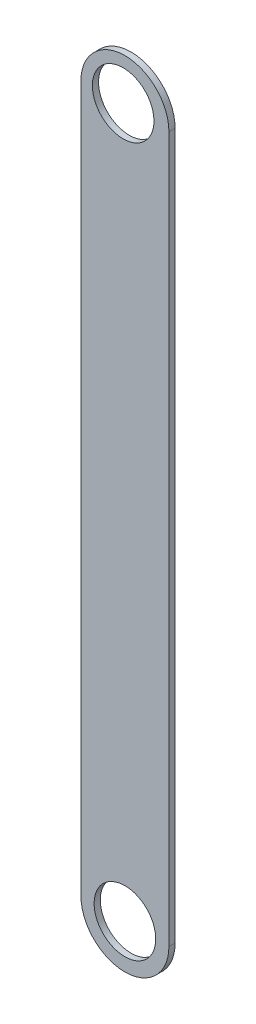
ISO-10303-21;
HEADER;
FILE_DESCRIPTION(('STEP AP214'),'2;1');
FILE_NAME('part.step','',(''),(''),'','','');
FILE_SCHEMA(('AUTOMOTIVE_DESIGN { 1 0 10303 214 1 1 1 1 }'));
ENDSEC;
DATA;
#1=APPLICATION_CONTEXT('core data for automotive mechanical design processes');
#2=APPLICATION_PROTOCOL_DEFINITION('international standard','automotive_design',2000,#1);
#3=PRODUCT_CONTEXT('',#1,'mechanical');
#4=PRODUCT('Part','Part','',(#3));
#5=PRODUCT_RELATED_PRODUCT_CATEGORY('part','',(#4));
#6=PRODUCT_DEFINITION_FORMATION('','',#4);
#7=PRODUCT_DEFINITION_CONTEXT('part definition',#1,'design');
#8=PRODUCT_DEFINITION('design','',#6,#7);
#9=PRODUCT_DEFINITION_SHAPE('','',#8);
#10=(LENGTH_UNIT() NAMED_UNIT(*) SI_UNIT(.MILLI.,.METRE.));
#11=(NAMED_UNIT(*) PLANE_ANGLE_UNIT() SI_UNIT($,.RADIAN.));
#12=(NAMED_UNIT(*) SI_UNIT($,.STERADIAN.) SOLID_ANGLE_UNIT());
#13=UNCERTAINTY_MEASURE_WITH_UNIT(LENGTH_MEASURE(1.E-05),#10,'distance_accuracy_value','');
#14=(GEOMETRIC_REPRESENTATION_CONTEXT(3) GLOBAL_UNCERTAINTY_ASSIGNED_CONTEXT((#13)) GLOBAL_UNIT_ASSIGNED_CONTEXT((#10,
#11,#12)) REPRESENTATION_CONTEXT('',''));
#15=CARTESIAN_POINT('',(0.,0.,0.));
#16=DIRECTION('',(0.,0.,1.));
#17=DIRECTION('',(1.,0.,0.));
#18=AXIS2_PLACEMENT_3D('',#15,#16,#17);
#19=CARTESIAN_POINT('',(107.76,-108.63,-0.045));
#20=DIRECTION('',(0.,0.,-1.));
#21=DIRECTION('',(0.,-1.,0.));
#22=AXIS2_PLACEMENT_3D('',#19,#20,#21);
#23=CYLINDRICAL_SURFACE('',#22,0.175);
#24=CARTESIAN_POINT('',(107.76,-108.63,-0.035));
#25=DIRECTION('',(0.,0.,-1.));
#26=DIRECTION('',(0.,-1.,0.));
#27=AXIS2_PLACEMENT_3D('',#24,#25,#26);
#28=CIRCLE('',#27,0.175);
#29=CARTESIAN_POINT('',(107.76,-108.805,-0.035));
#30=VERTEX_POINT('',#29);
#31=EDGE_CURVE('E94',#30,#30,#28,.T.);
#32=ORIENTED_EDGE('',*,*,#31,.T.);
#33=DIRECTION('',(0.,0.,1.));
#34=VECTOR('',#33,1.);
#35=CARTESIAN_POINT('',(107.76,-108.805,-0.045));
#36=LINE('',#35,#34);
#37=CARTESIAN_POINT('',(107.76,-108.805,0.));
#38=VERTEX_POINT('',#37);
#39=EDGE_CURVE('E11',#30,#38,#36,.T.);
#40=ORIENTED_EDGE('',*,*,#39,.T.);
#41=CARTESIAN_POINT('',(107.76,-108.63,0.));
#42=DIRECTION('',(0.,0.,-1.));
#43=DIRECTION('',(0.,-1.,0.));
#44=AXIS2_PLACEMENT_3D('',#41,#42,#43);
#45=CIRCLE('',#44,0.175);
#46=EDGE_CURVE('E118',#38,#38,#45,.T.);
#47=ORIENTED_EDGE('',*,*,#46,.F.);
#48=ORIENTED_EDGE('',*,*,#39,.F.);
#49=EDGE_LOOP('',(#32,#40,#47,#48));
#50=FACE_BOUND('',#49,.T.);
#51=ADVANCED_FACE('F17',(#50),#23,.F.);
#52=CARTESIAN_POINT('',(107.77,-112.65,-0.045));
#53=DIRECTION('',(0.,0.,-1.));
#54=DIRECTION('',(0.,-1.,0.));
#55=AXIS2_PLACEMENT_3D('',#52,#53,#54);
#56=CYLINDRICAL_SURFACE('',#55,0.175);
#57=CARTESIAN_POINT('',(107.77,-112.65,-0.035));
#58=DIRECTION('',(0.,0.,-1.));
#59=DIRECTION('',(0.,-1.,0.));
#60=AXIS2_PLACEMENT_3D('',#57,#58,#59);
#61=CIRCLE('',#60,0.175);
#62=CARTESIAN_POINT('',(107.77,-112.825,-0.035));
#63=VERTEX_POINT('',#62);
#64=EDGE_CURVE('E124',#63,#63,#61,.T.);
#65=ORIENTED_EDGE('',*,*,#64,.T.);
#66=DIRECTION('',(0.,0.,1.));
#67=VECTOR('',#66,1.);
#68=CARTESIAN_POINT('',(107.77,-112.825,-0.045));
#69=LINE('',#68,#67);
#70=CARTESIAN_POINT('',(107.77,-112.825,0.));
#71=VERTEX_POINT('',#70);
#72=EDGE_CURVE('E27',#63,#71,#69,.T.);
#73=ORIENTED_EDGE('',*,*,#72,.T.);
#74=CARTESIAN_POINT('',(107.77,-112.65,0.));
#75=DIRECTION('',(0.,0.,-1.));
#76=DIRECTION('',(0.,-1.,0.));
#77=AXIS2_PLACEMENT_3D('',#74,#75,#76);
#78=CIRCLE('',#77,0.175);
#79=EDGE_CURVE('E93',#71,#71,#78,.T.);
#80=ORIENTED_EDGE('',*,*,#79,.F.);
#81=ORIENTED_EDGE('',*,*,#72,.F.);
#82=EDGE_LOOP('',(#65,#73,#80,#81));
#83=FACE_BOUND('',#82,.T.);
#84=ADVANCED_FACE('F19',(#83),#56,.F.);
#85=CARTESIAN_POINT('',(107.52,-108.64,-0.035));
#86=DIRECTION('',(1.,0.,0.));
#87=DIRECTION('',(0.,1.,0.));
#88=AXIS2_PLACEMENT_3D('',#85,#86,#87);
#89=PLANE('',#88);
#90=DIRECTION('',(0.,-1.,0.));
#91=VECTOR('',#90,1.);
#92=CARTESIAN_POINT('',(107.52,-108.64,-0.035));
#93=LINE('',#92,#91);
#94=CARTESIAN_POINT('',(107.52,-108.64,-0.035));
#95=VERTEX_POINT('',#94);
#96=CARTESIAN_POINT('',(107.52,-112.65,-0.035));
#97=VERTEX_POINT('',#96);
#98=EDGE_CURVE('E105',#95,#97,#93,.T.);
#99=ORIENTED_EDGE('',*,*,#98,.T.);
#100=DIRECTION('',(0.,0.,1.));
#101=VECTOR('',#100,1.);
#102=CARTESIAN_POINT('',(107.52,-112.65,-0.035));
#103=LINE('',#102,#101);
#104=CARTESIAN_POINT('',(107.52,-112.65,0.));
#105=VERTEX_POINT('',#104);
#106=EDGE_CURVE('E89',#97,#105,#103,.T.);
#107=ORIENTED_EDGE('',*,*,#106,.T.);
#108=DIRECTION('',(0.,-1.,0.));
#109=VECTOR('',#108,1.);
#110=CARTESIAN_POINT('',(107.52,-108.64,0.));
#111=LINE('',#110,#109);
#112=CARTESIAN_POINT('',(107.52,-108.64,0.));
#113=VERTEX_POINT('',#112);
#114=EDGE_CURVE('E82',#113,#105,#111,.T.);
#115=ORIENTED_EDGE('',*,*,#114,.F.);
#116=DIRECTION('',(0.,0.,1.));
#117=VECTOR('',#116,1.);
#118=CARTESIAN_POINT('',(107.52,-108.64,-0.035));
#119=LINE('',#118,#117);
#120=EDGE_CURVE('E86',#95,#113,#119,.T.);
#121=ORIENTED_EDGE('',*,*,#120,.F.);
#122=EDGE_LOOP('',(#99,#107,#115,#121));
#123=FACE_BOUND('',#122,.T.);
#124=ADVANCED_FACE('F84',(#123),#89,.F.);
#125=CARTESIAN_POINT('',(108.02,-112.65,0.));
#126=DIRECTION('',(0.,0.,1.));
#127=DIRECTION('',(1.,0.,0.));
#128=AXIS2_PLACEMENT_3D('',#125,#126,#127);
#129=PLANE('',#128);
#130=ORIENTED_EDGE('',*,*,#46,.T.);
#131=EDGE_LOOP('',(#130));
#132=FACE_BOUND('',#131,.T.);
#133=ORIENTED_EDGE('',*,*,#79,.T.);
#134=EDGE_LOOP('',(#133));
#135=FACE_BOUND('',#134,.T.);
#136=DIRECTION('',(0.,1.,0.));
#137=VECTOR('',#136,1.);
#138=CARTESIAN_POINT('',(108.02,-112.65,0.));
#139=LINE('',#138,#137);
#140=CARTESIAN_POINT('',(108.02,-112.65,0.));
#141=VERTEX_POINT('',#140);
#142=CARTESIAN_POINT('',(108.02,-108.64,0.));
#143=VERTEX_POINT('',#142);
#144=EDGE_CURVE('E100',#141,#143,#139,.T.);
#145=ORIENTED_EDGE('',*,*,#144,.T.);
#146=CARTESIAN_POINT('',(107.77,-108.64,0.));
#147=DIRECTION('',(0.,0.,1.));
#148=DIRECTION('',(1.,0.,0.));
#149=AXIS2_PLACEMENT_3D('',#146,#147,#148);
#150=CIRCLE('',#149,0.25);
#151=EDGE_CURVE('E97',#143,#113,#150,.T.);
#152=ORIENTED_EDGE('',*,*,#151,.T.);
#153=ORIENTED_EDGE('',*,*,#114,.T.);
#154=CARTESIAN_POINT('',(107.77,-112.65,0.));
#155=DIRECTION('',(0.,0.,1.));
#156=DIRECTION('',(-1.,0.,0.));
#157=AXIS2_PLACEMENT_3D('',#154,#155,#156);
#158=CIRCLE('',#157,0.25);
#159=EDGE_CURVE('E120',#105,#141,#158,.T.);
#160=ORIENTED_EDGE('',*,*,#159,.T.);
#161=EDGE_LOOP('',(#145,#152,#153,#160));
#162=FACE_BOUND('',#161,.T.);
#163=ADVANCED_FACE('F98',(#132,#135,#162),#129,.T.);
#164=CARTESIAN_POINT('',(108.02,-112.65,-0.035));
#165=DIRECTION('',(0.,0.,1.));
#166=DIRECTION('',(1.,0.,0.));
#167=AXIS2_PLACEMENT_3D('',#164,#165,#166);
#168=PLANE('',#167);
#169=ORIENTED_EDGE('',*,*,#31,.F.);
#170=EDGE_LOOP('',(#169));
#171=FACE_BOUND('',#170,.T.);
#172=ORIENTED_EDGE('',*,*,#64,.F.);
#173=EDGE_LOOP('',(#172));
#174=FACE_BOUND('',#173,.T.);
#175=CARTESIAN_POINT('',(107.77,-112.65,-0.035));
#176=DIRECTION('',(0.,0.,1.));
#177=DIRECTION('',(-1.,0.,0.));
#178=AXIS2_PLACEMENT_3D('',#175,#176,#177);
#179=CIRCLE('',#178,0.25);
#180=CARTESIAN_POINT('',(108.02,-112.65,-0.035));
#181=VERTEX_POINT('',#180);
#182=EDGE_CURVE('E123',#97,#181,#179,.T.);
#183=ORIENTED_EDGE('',*,*,#182,.F.);
#184=ORIENTED_EDGE('',*,*,#98,.F.);
#185=CARTESIAN_POINT('',(107.77,-108.64,-0.035));
#186=DIRECTION('',(0.,0.,1.));
#187=DIRECTION('',(1.,0.,0.));
#188=AXIS2_PLACEMENT_3D('',#185,#186,#187);
#189=CIRCLE('',#188,0.25);
#190=CARTESIAN_POINT('',(108.02,-108.64,-0.035));
#191=VERTEX_POINT('',#190);
#192=EDGE_CURVE('E108',#191,#95,#189,.T.);
#193=ORIENTED_EDGE('',*,*,#192,.F.);
#194=DIRECTION('',(0.,1.,0.));
#195=VECTOR('',#194,1.);
#196=CARTESIAN_POINT('',(108.02,-112.65,-0.035));
#197=LINE('',#196,#195);
#198=EDGE_CURVE('E212',#181,#191,#197,.T.);
#199=ORIENTED_EDGE('',*,*,#198,.F.);
#200=EDGE_LOOP('',(#183,#184,#193,#199));
#201=FACE_BOUND('',#200,.T.);
#202=ADVANCED_FACE('F203',(#171,#174,#201),#168,.F.);
#203=CARTESIAN_POINT('',(107.77,-108.64,-0.035));
#204=DIRECTION('',(0.,0.,-1.));
#205=DIRECTION('',(1.,0.,0.));
#206=AXIS2_PLACEMENT_3D('',#203,#204,#205);
#207=CYLINDRICAL_SURFACE('',#206,0.25);
#208=ORIENTED_EDGE('',*,*,#192,.T.);
#209=ORIENTED_EDGE('',*,*,#120,.T.);
#210=ORIENTED_EDGE('',*,*,#151,.F.);
#211=DIRECTION('',(0.,0.,1.));
#212=VECTOR('',#211,1.);
#213=CARTESIAN_POINT('',(108.02,-108.64,-0.035));
#214=LINE('',#213,#212);
#215=EDGE_CURVE('E225',#191,#143,#214,.T.);
#216=ORIENTED_EDGE('',*,*,#215,.F.);
#217=EDGE_LOOP('',(#208,#209,#210,#216));
#218=FACE_BOUND('',#217,.T.);
#219=ADVANCED_FACE('F107',(#218),#207,.T.);
#220=CARTESIAN_POINT('',(107.77,-112.65,-0.035));
#221=DIRECTION('',(0.,0.,-1.));
#222=DIRECTION('',(-1.,0.,0.));
#223=AXIS2_PLACEMENT_3D('',#220,#221,#222);
#224=CYLINDRICAL_SURFACE('',#223,0.25);
#225=ORIENTED_EDGE('',*,*,#182,.T.);
#226=DIRECTION('',(0.,0.,1.));
#227=VECTOR('',#226,1.);
#228=CARTESIAN_POINT('',(108.02,-112.65,-0.035));
#229=LINE('',#228,#227);
#230=EDGE_CURVE('E217',#181,#141,#229,.T.);
#231=ORIENTED_EDGE('',*,*,#230,.T.);
#232=ORIENTED_EDGE('',*,*,#159,.F.);
#233=ORIENTED_EDGE('',*,*,#106,.F.);
#234=EDGE_LOOP('',(#225,#231,#232,#233));
#235=FACE_BOUND('',#234,.T.);
#236=ADVANCED_FACE('F233',(#235),#224,.T.);
#237=CARTESIAN_POINT('',(108.02,-112.65,-0.035));
#238=DIRECTION('',(-1.,0.,0.));
#239=DIRECTION('',(0.,0.,1.));
#240=AXIS2_PLACEMENT_3D('',#237,#238,#239);
#241=PLANE('',#240);
#242=ORIENTED_EDGE('',*,*,#198,.T.);
#243=ORIENTED_EDGE('',*,*,#215,.T.);
#244=ORIENTED_EDGE('',*,*,#144,.F.);
#245=ORIENTED_EDGE('',*,*,#230,.F.);
#246=EDGE_LOOP('',(#242,#243,#244,#245));
#247=FACE_BOUND('',#246,.T.);
#248=ADVANCED_FACE('F232',(#247),#241,.F.);
#249=CLOSED_SHELL('',(#51,#84,#124,#163,#202,#219,#236,#248));
#250=MANIFOLD_SOLID_BREP('B1',#249);
#251=ADVANCED_BREP_SHAPE_REPRESENTATION('',(#18,#250),#14);
#252=SHAPE_DEFINITION_REPRESENTATION(#9,#251);
ENDSEC;
END-ISO-10303-21;
